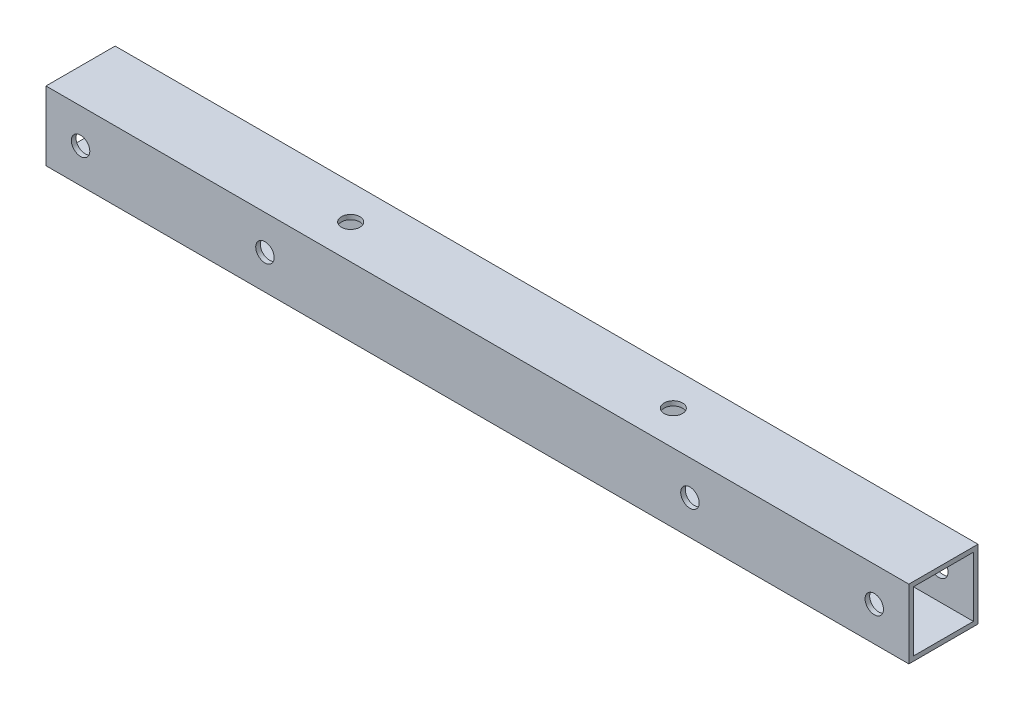
ISO-10303-21;
HEADER;
FILE_DESCRIPTION(('STEP AP214'),'2;1');
FILE_NAME('part.step','',(''),(''),'','','');
FILE_SCHEMA(('AUTOMOTIVE_DESIGN { 1 0 10303 214 1 1 1 1 }'));
ENDSEC;
DATA;
#1=APPLICATION_CONTEXT('core data for automotive mechanical design processes');
#2=APPLICATION_PROTOCOL_DEFINITION('international standard','automotive_design',2000,#1);
#3=PRODUCT_CONTEXT('',#1,'mechanical');
#4=PRODUCT('Part','Part','',(#3));
#5=PRODUCT_RELATED_PRODUCT_CATEGORY('part','',(#4));
#6=PRODUCT_DEFINITION_FORMATION('','',#4);
#7=PRODUCT_DEFINITION_CONTEXT('part definition',#1,'design');
#8=PRODUCT_DEFINITION('design','',#6,#7);
#9=PRODUCT_DEFINITION_SHAPE('','',#8);
#10=(LENGTH_UNIT() NAMED_UNIT(*) SI_UNIT(.MILLI.,.METRE.));
#11=(NAMED_UNIT(*) PLANE_ANGLE_UNIT() SI_UNIT($,.RADIAN.));
#12=(NAMED_UNIT(*) SI_UNIT($,.STERADIAN.) SOLID_ANGLE_UNIT());
#13=UNCERTAINTY_MEASURE_WITH_UNIT(LENGTH_MEASURE(1.E-05),#10,'distance_accuracy_value','');
#14=(GEOMETRIC_REPRESENTATION_CONTEXT(3) GLOBAL_UNCERTAINTY_ASSIGNED_CONTEXT((#13)) GLOBAL_UNIT_ASSIGNED_CONTEXT((#10,
#11,#12)) REPRESENTATION_CONTEXT('',''));
#15=CARTESIAN_POINT('',(0.,0.,0.));
#16=DIRECTION('',(0.,0.,1.));
#17=DIRECTION('',(1.,0.,0.));
#18=AXIS2_PLACEMENT_3D('',#15,#16,#17);
#19=CARTESIAN_POINT('',(187.2,0.,0.));
#20=DIRECTION('',(1.,0.,0.));
#21=DIRECTION('',(0.,0.,-1.));
#22=AXIS2_PLACEMENT_3D('',#19,#20,#21);
#23=PLANE('',#22);
#24=DIRECTION('',(0.,1.,0.));
#25=VECTOR('',#24,1.);
#26=CARTESIAN_POINT('',(187.2,-7.5,-7.5));
#27=LINE('',#26,#25);
#28=CARTESIAN_POINT('',(187.2,-7.5,-7.5));
#29=VERTEX_POINT('',#28);
#30=CARTESIAN_POINT('',(187.2,7.5,-7.5));
#31=VERTEX_POINT('',#30);
#32=EDGE_CURVE('E162',#29,#31,#27,.T.);
#33=ORIENTED_EDGE('',*,*,#32,.T.);
#34=DIRECTION('',(0.,0.,1.));
#35=VECTOR('',#34,1.);
#36=CARTESIAN_POINT('',(187.2,7.5,7.5));
#37=LINE('',#36,#35);
#38=CARTESIAN_POINT('',(187.2,7.5,7.5));
#39=VERTEX_POINT('',#38);
#40=EDGE_CURVE('E165',#31,#39,#37,.T.);
#41=ORIENTED_EDGE('',*,*,#40,.T.);
#42=DIRECTION('',(0.,-1.,0.));
#43=VECTOR('',#42,1.);
#44=CARTESIAN_POINT('',(187.2,-7.5,7.5));
#45=LINE('',#44,#43);
#46=CARTESIAN_POINT('',(187.2,-7.5,7.5));
#47=VERTEX_POINT('',#46);
#48=EDGE_CURVE('E168',#39,#47,#45,.T.);
#49=ORIENTED_EDGE('',*,*,#48,.T.);
#50=DIRECTION('',(0.,0.,-1.));
#51=VECTOR('',#50,1.);
#52=CARTESIAN_POINT('',(187.2,-7.5,7.5));
#53=LINE('',#52,#51);
#54=EDGE_CURVE('E170',#47,#29,#53,.T.);
#55=ORIENTED_EDGE('',*,*,#54,.T.);
#56=EDGE_LOOP('',(#33,#41,#49,#55));
#57=FACE_BOUND('',#56,.T.);
#58=DIRECTION('',(0.,0.,1.));
#59=VECTOR('',#58,1.);
#60=CARTESIAN_POINT('',(187.2,6.5,0.));
#61=LINE('',#60,#59);
#62=CARTESIAN_POINT('',(187.2,6.5,-6.5));
#63=VERTEX_POINT('',#62);
#64=CARTESIAN_POINT('',(187.2,6.5,6.5));
#65=VERTEX_POINT('',#64);
#66=EDGE_CURVE('E132',#63,#65,#61,.T.);
#67=ORIENTED_EDGE('',*,*,#66,.F.);
#68=DIRECTION('',(0.,1.,0.));
#69=VECTOR('',#68,1.);
#70=CARTESIAN_POINT('',(187.2,0.,-6.5));
#71=LINE('',#70,#69);
#72=CARTESIAN_POINT('',(187.2,-6.5,-6.5));
#73=VERTEX_POINT('',#72);
#74=EDGE_CURVE('E124',#73,#63,#71,.T.);
#75=ORIENTED_EDGE('',*,*,#74,.F.);
#76=DIRECTION('',(0.,0.,-1.));
#77=VECTOR('',#76,1.);
#78=CARTESIAN_POINT('',(187.2,-6.5,0.));
#79=LINE('',#78,#77);
#80=CARTESIAN_POINT('',(187.2,-6.5,6.5));
#81=VERTEX_POINT('',#80);
#82=EDGE_CURVE('E146',#81,#73,#79,.T.);
#83=ORIENTED_EDGE('',*,*,#82,.F.);
#84=DIRECTION('',(0.,-1.,0.));
#85=VECTOR('',#84,1.);
#86=CARTESIAN_POINT('',(187.2,0.,6.5));
#87=LINE('',#86,#85);
#88=EDGE_CURVE('E144',#65,#81,#87,.T.);
#89=ORIENTED_EDGE('',*,*,#88,.F.);
#90=EDGE_LOOP('',(#67,#75,#83,#89));
#91=FACE_BOUND('',#90,.T.);
#92=ADVANCED_FACE('F57',(#57,#91),#23,.T.);
#93=CARTESIAN_POINT('',(0.,0.,0.));
#94=DIRECTION('',(1.,0.,0.));
#95=DIRECTION('',(0.,0.,-1.));
#96=AXIS2_PLACEMENT_3D('',#93,#94,#95);
#97=PLANE('',#96);
#98=DIRECTION('',(0.,1.,0.));
#99=VECTOR('',#98,1.);
#100=CARTESIAN_POINT('',(0.,-7.5,-7.5));
#101=LINE('',#100,#99);
#102=CARTESIAN_POINT('',(0.,-7.5,-7.5));
#103=VERTEX_POINT('',#102);
#104=CARTESIAN_POINT('',(0.,7.5,-7.5));
#105=VERTEX_POINT('',#104);
#106=EDGE_CURVE('E140',#103,#105,#101,.T.);
#107=ORIENTED_EDGE('',*,*,#106,.F.);
#108=DIRECTION('',(0.,0.,-1.));
#109=VECTOR('',#108,1.);
#110=CARTESIAN_POINT('',(0.,-7.5,7.5));
#111=LINE('',#110,#109);
#112=CARTESIAN_POINT('',(0.,-7.5,7.5));
#113=VERTEX_POINT('',#112);
#114=EDGE_CURVE('E166',#113,#103,#111,.T.);
#115=ORIENTED_EDGE('',*,*,#114,.F.);
#116=DIRECTION('',(0.,-1.,0.));
#117=VECTOR('',#116,1.);
#118=CARTESIAN_POINT('',(0.,-7.5,7.5));
#119=LINE('',#118,#117);
#120=CARTESIAN_POINT('',(0.,7.5,7.5));
#121=VERTEX_POINT('',#120);
#122=EDGE_CURVE('E177',#121,#113,#119,.T.);
#123=ORIENTED_EDGE('',*,*,#122,.F.);
#124=DIRECTION('',(0.,0.,1.));
#125=VECTOR('',#124,1.);
#126=CARTESIAN_POINT('',(0.,7.5,7.5));
#127=LINE('',#126,#125);
#128=EDGE_CURVE('E175',#105,#121,#127,.T.);
#129=ORIENTED_EDGE('',*,*,#128,.F.);
#130=EDGE_LOOP('',(#107,#115,#123,#129));
#131=FACE_BOUND('',#130,.T.);
#132=DIRECTION('',(0.,1.,0.));
#133=VECTOR('',#132,1.);
#134=CARTESIAN_POINT('',(0.,0.,-6.5));
#135=LINE('',#134,#133);
#136=CARTESIAN_POINT('',(0.,-6.5,-6.5));
#137=VERTEX_POINT('',#136);
#138=CARTESIAN_POINT('',(0.,6.5,-6.5));
#139=VERTEX_POINT('',#138);
#140=EDGE_CURVE('E82',#137,#139,#135,.T.);
#141=ORIENTED_EDGE('',*,*,#140,.T.);
#142=DIRECTION('',(0.,0.,1.));
#143=VECTOR('',#142,1.);
#144=CARTESIAN_POINT('',(0.,6.5,0.));
#145=LINE('',#144,#143);
#146=CARTESIAN_POINT('',(0.,6.5,6.5));
#147=VERTEX_POINT('',#146);
#148=EDGE_CURVE('E139',#139,#147,#145,.T.);
#149=ORIENTED_EDGE('',*,*,#148,.T.);
#150=DIRECTION('',(0.,-1.,0.));
#151=VECTOR('',#150,1.);
#152=CARTESIAN_POINT('',(0.,0.,6.5));
#153=LINE('',#152,#151);
#154=CARTESIAN_POINT('',(0.,-6.5,6.5));
#155=VERTEX_POINT('',#154);
#156=EDGE_CURVE('E154',#147,#155,#153,.T.);
#157=ORIENTED_EDGE('',*,*,#156,.T.);
#158=DIRECTION('',(0.,0.,-1.));
#159=VECTOR('',#158,1.);
#160=CARTESIAN_POINT('',(0.,-6.5,0.));
#161=LINE('',#160,#159);
#162=EDGE_CURVE('E133',#155,#137,#161,.T.);
#163=ORIENTED_EDGE('',*,*,#162,.T.);
#164=EDGE_LOOP('',(#141,#149,#157,#163));
#165=FACE_BOUND('',#164,.T.);
#166=ADVANCED_FACE('F283',(#131,#165),#97,.F.);
#167=CARTESIAN_POINT('',(187.2,-7.5,-7.5));
#168=DIRECTION('',(0.,0.,1.));
#169=DIRECTION('',(1.,0.,0.));
#170=AXIS2_PLACEMENT_3D('',#167,#168,#169);
#171=PLANE('',#170);
#172=CARTESIAN_POINT('',(7.5,0.,-7.5));
#173=DIRECTION('',(0.,0.,1.));
#174=DIRECTION('',(1.,0.,0.));
#175=AXIS2_PLACEMENT_3D('',#172,#173,#174);
#176=CIRCLE('',#175,2.);
#177=CARTESIAN_POINT('',(9.5,0.,-7.5));
#178=VERTEX_POINT('',#177);
#179=EDGE_CURVE('E191',#178,#178,#176,.T.);
#180=ORIENTED_EDGE('',*,*,#179,.T.);
#181=EDGE_LOOP('',(#180));
#182=FACE_BOUND('',#181,.T.);
#183=CARTESIAN_POINT('',(47.5,0.,-7.5));
#184=DIRECTION('',(0.,0.,1.));
#185=DIRECTION('',(1.,0.,0.));
#186=AXIS2_PLACEMENT_3D('',#183,#184,#185);
#187=CIRCLE('',#186,2.);
#188=CARTESIAN_POINT('',(49.5,0.,-7.5));
#189=VERTEX_POINT('',#188);
#190=EDGE_CURVE('E233',#189,#189,#187,.T.);
#191=ORIENTED_EDGE('',*,*,#190,.T.);
#192=EDGE_LOOP('',(#191));
#193=FACE_BOUND('',#192,.T.);
#194=CARTESIAN_POINT('',(139.7,0.,-7.5));
#195=DIRECTION('',(0.,0.,1.));
#196=DIRECTION('',(-1.,0.,0.));
#197=AXIS2_PLACEMENT_3D('',#194,#195,#196);
#198=CIRCLE('',#197,2.);
#199=CARTESIAN_POINT('',(137.7,0.,-7.5));
#200=VERTEX_POINT('',#199);
#201=EDGE_CURVE('E239',#200,#200,#198,.T.);
#202=ORIENTED_EDGE('',*,*,#201,.T.);
#203=EDGE_LOOP('',(#202));
#204=FACE_BOUND('',#203,.T.);
#205=CARTESIAN_POINT('',(179.7,0.,-7.5));
#206=DIRECTION('',(0.,0.,1.));
#207=DIRECTION('',(-1.,0.,0.));
#208=AXIS2_PLACEMENT_3D('',#205,#206,#207);
#209=CIRCLE('',#208,2.);
#210=CARTESIAN_POINT('',(177.7,0.,-7.5));
#211=VERTEX_POINT('',#210);
#212=EDGE_CURVE('E245',#211,#211,#209,.T.);
#213=ORIENTED_EDGE('',*,*,#212,.T.);
#214=EDGE_LOOP('',(#213));
#215=FACE_BOUND('',#214,.T.);
#216=ORIENTED_EDGE('',*,*,#106,.T.);
#217=DIRECTION('',(-1.,0.,0.));
#218=VECTOR('',#217,1.);
#219=CARTESIAN_POINT('',(187.2,7.5,-7.5));
#220=LINE('',#219,#218);
#221=EDGE_CURVE('E12',#31,#105,#220,.T.);
#222=ORIENTED_EDGE('',*,*,#221,.F.);
#223=ORIENTED_EDGE('',*,*,#32,.F.);
#224=DIRECTION('',(-1.,0.,0.));
#225=VECTOR('',#224,1.);
#226=CARTESIAN_POINT('',(187.2,-7.5,-7.5));
#227=LINE('',#226,#225);
#228=EDGE_CURVE('E172',#29,#103,#227,.T.);
#229=ORIENTED_EDGE('',*,*,#228,.T.);
#230=EDGE_LOOP('',(#216,#222,#223,#229));
#231=FACE_BOUND('',#230,.T.);
#232=ADVANCED_FACE('F59',(#182,#193,#204,#215,#231),#171,.F.);
#233=CARTESIAN_POINT('',(187.2,7.5,7.5));
#234=DIRECTION('',(0.,-1.,0.));
#235=DIRECTION('',(0.,0.,-1.));
#236=AXIS2_PLACEMENT_3D('',#233,#234,#235);
#237=PLANE('',#236);
#238=CARTESIAN_POINT('',(58.6,7.5,0.));
#239=DIRECTION('',(0.,1.,0.));
#240=DIRECTION('',(0.,0.,1.));
#241=AXIS2_PLACEMENT_3D('',#238,#239,#240);
#242=CIRCLE('',#241,2.);
#243=CARTESIAN_POINT('',(58.6,7.5,2.));
#244=VERTEX_POINT('',#243);
#245=EDGE_CURVE('E211',#244,#244,#242,.T.);
#246=ORIENTED_EDGE('',*,*,#245,.F.);
#247=EDGE_LOOP('',(#246));
#248=FACE_BOUND('',#247,.T.);
#249=CARTESIAN_POINT('',(128.6,7.5,0.));
#250=DIRECTION('',(0.,1.,0.));
#251=DIRECTION('',(0.,0.,-1.));
#252=AXIS2_PLACEMENT_3D('',#249,#250,#251);
#253=CIRCLE('',#252,2.);
#254=CARTESIAN_POINT('',(128.6,7.5,-2.00000000000001));
#255=VERTEX_POINT('',#254);
#256=EDGE_CURVE('E221',#255,#255,#253,.T.);
#257=ORIENTED_EDGE('',*,*,#256,.F.);
#258=EDGE_LOOP('',(#257));
#259=FACE_BOUND('',#258,.T.);
#260=ORIENTED_EDGE('',*,*,#128,.T.);
#261=DIRECTION('',(-1.,0.,0.));
#262=VECTOR('',#261,1.);
#263=CARTESIAN_POINT('',(187.2,7.5,7.5));
#264=LINE('',#263,#262);
#265=EDGE_CURVE('E66',#39,#121,#264,.T.);
#266=ORIENTED_EDGE('',*,*,#265,.F.);
#267=ORIENTED_EDGE('',*,*,#40,.F.);
#268=ORIENTED_EDGE('',*,*,#221,.T.);
#269=EDGE_LOOP('',(#260,#266,#267,#268));
#270=FACE_BOUND('',#269,.T.);
#271=ADVANCED_FACE('F282',(#248,#259,#270),#237,.F.);
#272=CARTESIAN_POINT('',(187.2,-7.5,7.5));
#273=DIRECTION('',(0.,0.,-1.));
#274=DIRECTION('',(-1.,0.,0.));
#275=AXIS2_PLACEMENT_3D('',#272,#273,#274);
#276=PLANE('',#275);
#277=CARTESIAN_POINT('',(7.5,0.,7.5));
#278=DIRECTION('',(0.,0.,1.));
#279=DIRECTION('',(1.,0.,0.));
#280=AXIS2_PLACEMENT_3D('',#277,#278,#279);
#281=CIRCLE('',#280,2.);
#282=CARTESIAN_POINT('',(9.5,0.,7.5));
#283=VERTEX_POINT('',#282);
#284=EDGE_CURVE('E230',#283,#283,#281,.T.);
#285=ORIENTED_EDGE('',*,*,#284,.F.);
#286=EDGE_LOOP('',(#285));
#287=FACE_BOUND('',#286,.T.);
#288=CARTESIAN_POINT('',(47.5,0.,7.5));
#289=DIRECTION('',(0.,0.,1.));
#290=DIRECTION('',(1.,0.,0.));
#291=AXIS2_PLACEMENT_3D('',#288,#289,#290);
#292=CIRCLE('',#291,2.);
#293=CARTESIAN_POINT('',(49.5,0.,7.5));
#294=VERTEX_POINT('',#293);
#295=EDGE_CURVE('E236',#294,#294,#292,.T.);
#296=ORIENTED_EDGE('',*,*,#295,.F.);
#297=EDGE_LOOP('',(#296));
#298=FACE_BOUND('',#297,.T.);
#299=CARTESIAN_POINT('',(139.7,0.,7.5));
#300=DIRECTION('',(0.,0.,1.));
#301=DIRECTION('',(-1.,0.,0.));
#302=AXIS2_PLACEMENT_3D('',#299,#300,#301);
#303=CIRCLE('',#302,2.);
#304=CARTESIAN_POINT('',(137.7,0.,7.5));
#305=VERTEX_POINT('',#304);
#306=EDGE_CURVE('E242',#305,#305,#303,.T.);
#307=ORIENTED_EDGE('',*,*,#306,.F.);
#308=EDGE_LOOP('',(#307));
#309=FACE_BOUND('',#308,.T.);
#310=CARTESIAN_POINT('',(179.7,0.,7.5));
#311=DIRECTION('',(0.,0.,1.));
#312=DIRECTION('',(-1.,0.,0.));
#313=AXIS2_PLACEMENT_3D('',#310,#311,#312);
#314=CIRCLE('',#313,2.);
#315=CARTESIAN_POINT('',(177.7,0.,7.5));
#316=VERTEX_POINT('',#315);
#317=EDGE_CURVE('E227',#316,#316,#314,.T.);
#318=ORIENTED_EDGE('',*,*,#317,.F.);
#319=EDGE_LOOP('',(#318));
#320=FACE_BOUND('',#319,.T.);
#321=ORIENTED_EDGE('',*,*,#122,.T.);
#322=DIRECTION('',(-1.,0.,0.));
#323=VECTOR('',#322,1.);
#324=CARTESIAN_POINT('',(187.2,-7.5,7.5));
#325=LINE('',#324,#323);
#326=EDGE_CURVE('E182',#47,#113,#325,.T.);
#327=ORIENTED_EDGE('',*,*,#326,.F.);
#328=ORIENTED_EDGE('',*,*,#48,.F.);
#329=ORIENTED_EDGE('',*,*,#265,.T.);
#330=EDGE_LOOP('',(#321,#327,#328,#329));
#331=FACE_BOUND('',#330,.T.);
#332=ADVANCED_FACE('F301',(#287,#298,#309,#320,#331),#276,.F.);
#333=CARTESIAN_POINT('',(187.2,-7.5,7.5));
#334=DIRECTION('',(0.,1.,0.));
#335=DIRECTION('',(0.,0.,1.));
#336=AXIS2_PLACEMENT_3D('',#333,#334,#335);
#337=PLANE('',#336);
#338=CARTESIAN_POINT('',(58.6,-7.5,0.));
#339=DIRECTION('',(0.,1.,0.));
#340=DIRECTION('',(0.,0.,1.));
#341=AXIS2_PLACEMENT_3D('',#338,#339,#340);
#342=CIRCLE('',#341,2.);
#343=CARTESIAN_POINT('',(58.6,-7.5,2.));
#344=VERTEX_POINT('',#343);
#345=EDGE_CURVE('E205',#344,#344,#342,.T.);
#346=ORIENTED_EDGE('',*,*,#345,.T.);
#347=EDGE_LOOP('',(#346));
#348=FACE_BOUND('',#347,.T.);
#349=CARTESIAN_POINT('',(128.6,-7.5,0.));
#350=DIRECTION('',(0.,1.,0.));
#351=DIRECTION('',(0.,0.,-1.));
#352=AXIS2_PLACEMENT_3D('',#349,#350,#351);
#353=CIRCLE('',#352,2.);
#354=CARTESIAN_POINT('',(128.6,-7.5,-2.00000000000001));
#355=VERTEX_POINT('',#354);
#356=EDGE_CURVE('E216',#355,#355,#353,.T.);
#357=ORIENTED_EDGE('',*,*,#356,.T.);
#358=EDGE_LOOP('',(#357));
#359=FACE_BOUND('',#358,.T.);
#360=ORIENTED_EDGE('',*,*,#114,.T.);
#361=ORIENTED_EDGE('',*,*,#228,.F.);
#362=ORIENTED_EDGE('',*,*,#54,.F.);
#363=ORIENTED_EDGE('',*,*,#326,.T.);
#364=EDGE_LOOP('',(#360,#361,#362,#363));
#365=FACE_BOUND('',#364,.T.);
#366=ADVANCED_FACE('F263',(#348,#359,#365),#337,.F.);
#367=CARTESIAN_POINT('',(187.2,0.,-6.5));
#368=DIRECTION('',(0.,0.,1.));
#369=DIRECTION('',(1.,0.,0.));
#370=AXIS2_PLACEMENT_3D('',#367,#368,#369);
#371=PLANE('',#370);
#372=CARTESIAN_POINT('',(7.5,0.,-6.5));
#373=DIRECTION('',(0.,0.,1.));
#374=DIRECTION('',(1.,0.,0.));
#375=AXIS2_PLACEMENT_3D('',#372,#373,#374);
#376=CIRCLE('',#375,2.);
#377=CARTESIAN_POINT('',(9.5,0.,-6.5));
#378=VERTEX_POINT('',#377);
#379=EDGE_CURVE('E152',#378,#378,#376,.T.);
#380=ORIENTED_EDGE('',*,*,#379,.F.);
#381=EDGE_LOOP('',(#380));
#382=FACE_BOUND('',#381,.T.);
#383=CARTESIAN_POINT('',(47.5,0.,-6.5));
#384=DIRECTION('',(0.,0.,1.));
#385=DIRECTION('',(1.,0.,0.));
#386=AXIS2_PLACEMENT_3D('',#383,#384,#385);
#387=CIRCLE('',#386,2.);
#388=CARTESIAN_POINT('',(49.5,0.,-6.5));
#389=VERTEX_POINT('',#388);
#390=EDGE_CURVE('E199',#389,#389,#387,.T.);
#391=ORIENTED_EDGE('',*,*,#390,.F.);
#392=EDGE_LOOP('',(#391));
#393=FACE_BOUND('',#392,.T.);
#394=CARTESIAN_POINT('',(139.7,0.,-6.5));
#395=DIRECTION('',(0.,0.,1.));
#396=DIRECTION('',(1.,0.,0.));
#397=AXIS2_PLACEMENT_3D('',#394,#395,#396);
#398=CIRCLE('',#397,2.);
#399=CARTESIAN_POINT('',(141.7,0.,-6.5));
#400=VERTEX_POINT('',#399);
#401=EDGE_CURVE('E195',#400,#400,#398,.T.);
#402=ORIENTED_EDGE('',*,*,#401,.F.);
#403=EDGE_LOOP('',(#402));
#404=FACE_BOUND('',#403,.T.);
#405=CARTESIAN_POINT('',(179.7,0.,-6.5));
#406=DIRECTION('',(0.,0.,1.));
#407=DIRECTION('',(1.,0.,0.));
#408=AXIS2_PLACEMENT_3D('',#405,#406,#407);
#409=CIRCLE('',#408,2.);
#410=CARTESIAN_POINT('',(181.7,0.,-6.5));
#411=VERTEX_POINT('',#410);
#412=EDGE_CURVE('E190',#411,#411,#409,.T.);
#413=ORIENTED_EDGE('',*,*,#412,.F.);
#414=EDGE_LOOP('',(#413));
#415=FACE_BOUND('',#414,.T.);
#416=ORIENTED_EDGE('',*,*,#140,.F.);
#417=DIRECTION('',(-1.,0.,0.));
#418=VECTOR('',#417,1.);
#419=CARTESIAN_POINT('',(187.2,-6.5,-6.5));
#420=LINE('',#419,#418);
#421=EDGE_CURVE('E128',#73,#137,#420,.T.);
#422=ORIENTED_EDGE('',*,*,#421,.F.);
#423=ORIENTED_EDGE('',*,*,#74,.T.);
#424=DIRECTION('',(-1.,0.,0.));
#425=VECTOR('',#424,1.);
#426=CARTESIAN_POINT('',(187.2,6.5,-6.5));
#427=LINE('',#426,#425);
#428=EDGE_CURVE('E127',#63,#139,#427,.T.);
#429=ORIENTED_EDGE('',*,*,#428,.T.);
#430=EDGE_LOOP('',(#416,#422,#423,#429));
#431=FACE_BOUND('',#430,.T.);
#432=ADVANCED_FACE('F126',(#382,#393,#404,#415,#431),#371,.T.);
#433=CARTESIAN_POINT('',(187.2,6.5,0.));
#434=DIRECTION('',(0.,-1.,0.));
#435=DIRECTION('',(0.,0.,-1.));
#436=AXIS2_PLACEMENT_3D('',#433,#434,#435);
#437=PLANE('',#436);
#438=CARTESIAN_POINT('',(58.6,6.5,0.));
#439=DIRECTION('',(0.,-1.,0.));
#440=DIRECTION('',(0.,0.,-1.));
#441=AXIS2_PLACEMENT_3D('',#438,#439,#440);
#442=CIRCLE('',#441,2.);
#443=CARTESIAN_POINT('',(58.6,6.5,-2.));
#444=VERTEX_POINT('',#443);
#445=EDGE_CURVE('E224',#444,#444,#442,.T.);
#446=ORIENTED_EDGE('',*,*,#445,.F.);
#447=EDGE_LOOP('',(#446));
#448=FACE_BOUND('',#447,.T.);
#449=CARTESIAN_POINT('',(128.6,6.5,0.));
#450=DIRECTION('',(0.,-1.,0.));
#451=DIRECTION('',(0.,0.,-1.));
#452=AXIS2_PLACEMENT_3D('',#449,#450,#451);
#453=CIRCLE('',#452,2.);
#454=CARTESIAN_POINT('',(128.6,6.5,-2.00000000000001));
#455=VERTEX_POINT('',#454);
#456=EDGE_CURVE('E204',#455,#455,#453,.T.);
#457=ORIENTED_EDGE('',*,*,#456,.F.);
#458=EDGE_LOOP('',(#457));
#459=FACE_BOUND('',#458,.T.);
#460=ORIENTED_EDGE('',*,*,#148,.F.);
#461=ORIENTED_EDGE('',*,*,#428,.F.);
#462=ORIENTED_EDGE('',*,*,#66,.T.);
#463=DIRECTION('',(-1.,0.,0.));
#464=VECTOR('',#463,1.);
#465=CARTESIAN_POINT('',(187.2,6.5,6.5));
#466=LINE('',#465,#464);
#467=EDGE_CURVE('E141',#65,#147,#466,.T.);
#468=ORIENTED_EDGE('',*,*,#467,.T.);
#469=EDGE_LOOP('',(#460,#461,#462,#468));
#470=FACE_BOUND('',#469,.T.);
#471=ADVANCED_FACE('F136',(#448,#459,#470),#437,.T.);
#472=CARTESIAN_POINT('',(187.2,0.,6.5));
#473=DIRECTION('',(0.,0.,-1.));
#474=DIRECTION('',(-1.,0.,0.));
#475=AXIS2_PLACEMENT_3D('',#472,#473,#474);
#476=PLANE('',#475);
#477=CARTESIAN_POINT('',(7.5,0.,6.5));
#478=DIRECTION('',(0.,0.,-1.));
#479=DIRECTION('',(-1.,0.,0.));
#480=AXIS2_PLACEMENT_3D('',#477,#478,#479);
#481=CIRCLE('',#480,2.);
#482=CARTESIAN_POINT('',(5.5,0.,6.5));
#483=VERTEX_POINT('',#482);
#484=EDGE_CURVE('E200',#483,#483,#481,.T.);
#485=ORIENTED_EDGE('',*,*,#484,.F.);
#486=EDGE_LOOP('',(#485));
#487=FACE_BOUND('',#486,.T.);
#488=CARTESIAN_POINT('',(47.5,0.,6.5));
#489=DIRECTION('',(0.,0.,-1.));
#490=DIRECTION('',(-1.,0.,0.));
#491=AXIS2_PLACEMENT_3D('',#488,#489,#490);
#492=CIRCLE('',#491,2.);
#493=CARTESIAN_POINT('',(45.5,0.,6.5));
#494=VERTEX_POINT('',#493);
#495=EDGE_CURVE('E196',#494,#494,#492,.T.);
#496=ORIENTED_EDGE('',*,*,#495,.F.);
#497=EDGE_LOOP('',(#496));
#498=FACE_BOUND('',#497,.T.);
#499=CARTESIAN_POINT('',(139.7,0.,6.5));
#500=DIRECTION('',(0.,0.,-1.));
#501=DIRECTION('',(-1.,0.,0.));
#502=AXIS2_PLACEMENT_3D('',#499,#500,#501);
#503=CIRCLE('',#502,2.);
#504=CARTESIAN_POINT('',(137.7,0.,6.5));
#505=VERTEX_POINT('',#504);
#506=EDGE_CURVE('E192',#505,#505,#503,.T.);
#507=ORIENTED_EDGE('',*,*,#506,.F.);
#508=EDGE_LOOP('',(#507));
#509=FACE_BOUND('',#508,.T.);
#510=CARTESIAN_POINT('',(179.7,0.,6.5));
#511=DIRECTION('',(0.,0.,-1.));
#512=DIRECTION('',(-1.,0.,0.));
#513=AXIS2_PLACEMENT_3D('',#510,#511,#512);
#514=CIRCLE('',#513,2.);
#515=CARTESIAN_POINT('',(177.7,0.,6.5));
#516=VERTEX_POINT('',#515);
#517=EDGE_CURVE('E187',#516,#516,#514,.T.);
#518=ORIENTED_EDGE('',*,*,#517,.F.);
#519=EDGE_LOOP('',(#518));
#520=FACE_BOUND('',#519,.T.);
#521=ORIENTED_EDGE('',*,*,#156,.F.);
#522=ORIENTED_EDGE('',*,*,#467,.F.);
#523=ORIENTED_EDGE('',*,*,#88,.T.);
#524=DIRECTION('',(-1.,0.,0.));
#525=VECTOR('',#524,1.);
#526=CARTESIAN_POINT('',(187.2,-6.5,6.5));
#527=LINE('',#526,#525);
#528=EDGE_CURVE('E74',#81,#155,#527,.T.);
#529=ORIENTED_EDGE('',*,*,#528,.T.);
#530=EDGE_LOOP('',(#521,#522,#523,#529));
#531=FACE_BOUND('',#530,.T.);
#532=ADVANCED_FACE('F322',(#487,#498,#509,#520,#531),#476,.T.);
#533=CARTESIAN_POINT('',(187.2,-6.5,0.));
#534=DIRECTION('',(0.,1.,0.));
#535=DIRECTION('',(0.,0.,1.));
#536=AXIS2_PLACEMENT_3D('',#533,#534,#535);
#537=PLANE('',#536);
#538=CARTESIAN_POINT('',(58.6,-6.5,0.));
#539=DIRECTION('',(0.,1.,0.));
#540=DIRECTION('',(0.,0.,1.));
#541=AXIS2_PLACEMENT_3D('',#538,#539,#540);
#542=CIRCLE('',#541,2.);
#543=CARTESIAN_POINT('',(58.6,-6.5,2.));
#544=VERTEX_POINT('',#543);
#545=EDGE_CURVE('E61',#544,#544,#542,.T.);
#546=ORIENTED_EDGE('',*,*,#545,.F.);
#547=EDGE_LOOP('',(#546));
#548=FACE_BOUND('',#547,.T.);
#549=CARTESIAN_POINT('',(128.6,-6.5,0.));
#550=DIRECTION('',(0.,1.,0.));
#551=DIRECTION('',(0.,0.,1.));
#552=AXIS2_PLACEMENT_3D('',#549,#550,#551);
#553=CIRCLE('',#552,2.);
#554=CARTESIAN_POINT('',(128.6,-6.5,1.99999999999999));
#555=VERTEX_POINT('',#554);
#556=EDGE_CURVE('E202',#555,#555,#553,.T.);
#557=ORIENTED_EDGE('',*,*,#556,.F.);
#558=EDGE_LOOP('',(#557));
#559=FACE_BOUND('',#558,.T.);
#560=ORIENTED_EDGE('',*,*,#162,.F.);
#561=ORIENTED_EDGE('',*,*,#528,.F.);
#562=ORIENTED_EDGE('',*,*,#82,.T.);
#563=ORIENTED_EDGE('',*,*,#421,.T.);
#564=EDGE_LOOP('',(#560,#561,#562,#563));
#565=FACE_BOUND('',#564,.T.);
#566=ADVANCED_FACE('F326',(#548,#559,#565),#537,.T.);
#567=CARTESIAN_POINT('',(179.7,0.,-7.5));
#568=DIRECTION('',(0.,0.,1.));
#569=DIRECTION('',(1.,0.,0.));
#570=AXIS2_PLACEMENT_3D('',#567,#568,#569);
#571=CYLINDRICAL_SURFACE('',#570,2.);
#572=ORIENTED_EDGE('',*,*,#517,.T.);
#573=EDGE_LOOP('',(#572));
#574=FACE_BOUND('',#573,.T.);
#575=ORIENTED_EDGE('',*,*,#317,.T.);
#576=EDGE_LOOP('',(#575));
#577=FACE_BOUND('',#576,.T.);
#578=ADVANCED_FACE('F277',(#574,#577),#571,.F.);
#579=CARTESIAN_POINT('',(139.7,0.,-7.5));
#580=DIRECTION('',(0.,0.,1.));
#581=DIRECTION('',(1.,0.,0.));
#582=AXIS2_PLACEMENT_3D('',#579,#580,#581);
#583=CYLINDRICAL_SURFACE('',#582,2.);
#584=ORIENTED_EDGE('',*,*,#506,.T.);
#585=EDGE_LOOP('',(#584));
#586=FACE_BOUND('',#585,.T.);
#587=ORIENTED_EDGE('',*,*,#306,.T.);
#588=EDGE_LOOP('',(#587));
#589=FACE_BOUND('',#588,.T.);
#590=ADVANCED_FACE('F332',(#586,#589),#583,.F.);
#591=CARTESIAN_POINT('',(47.5,0.,-7.5));
#592=DIRECTION('',(0.,0.,1.));
#593=DIRECTION('',(1.,0.,0.));
#594=AXIS2_PLACEMENT_3D('',#591,#592,#593);
#595=CYLINDRICAL_SURFACE('',#594,2.);
#596=ORIENTED_EDGE('',*,*,#495,.T.);
#597=EDGE_LOOP('',(#596));
#598=FACE_BOUND('',#597,.T.);
#599=ORIENTED_EDGE('',*,*,#295,.T.);
#600=EDGE_LOOP('',(#599));
#601=FACE_BOUND('',#600,.T.);
#602=ADVANCED_FACE('F336',(#598,#601),#595,.F.);
#603=CARTESIAN_POINT('',(7.5,0.,-7.5));
#604=DIRECTION('',(0.,0.,1.));
#605=DIRECTION('',(1.,0.,0.));
#606=AXIS2_PLACEMENT_3D('',#603,#604,#605);
#607=CYLINDRICAL_SURFACE('',#606,2.);
#608=ORIENTED_EDGE('',*,*,#484,.T.);
#609=EDGE_LOOP('',(#608));
#610=FACE_BOUND('',#609,.T.);
#611=ORIENTED_EDGE('',*,*,#284,.T.);
#612=EDGE_LOOP('',(#611));
#613=FACE_BOUND('',#612,.T.);
#614=ADVANCED_FACE('F275',(#610,#613),#607,.F.);
#615=ORIENTED_EDGE('',*,*,#412,.T.);
#616=EDGE_LOOP('',(#615));
#617=FACE_BOUND('',#616,.T.);
#618=ORIENTED_EDGE('',*,*,#212,.F.);
#619=EDGE_LOOP('',(#618));
#620=FACE_BOUND('',#619,.T.);
#621=ADVANCED_FACE('F271',(#617,#620),#571,.F.);
#622=ORIENTED_EDGE('',*,*,#401,.T.);
#623=EDGE_LOOP('',(#622));
#624=FACE_BOUND('',#623,.T.);
#625=ORIENTED_EDGE('',*,*,#201,.F.);
#626=EDGE_LOOP('',(#625));
#627=FACE_BOUND('',#626,.T.);
#628=ADVANCED_FACE('F274',(#624,#627),#583,.F.);
#629=ORIENTED_EDGE('',*,*,#390,.T.);
#630=EDGE_LOOP('',(#629));
#631=FACE_BOUND('',#630,.T.);
#632=ORIENTED_EDGE('',*,*,#190,.F.);
#633=EDGE_LOOP('',(#632));
#634=FACE_BOUND('',#633,.T.);
#635=ADVANCED_FACE('F341',(#631,#634),#595,.F.);
#636=ORIENTED_EDGE('',*,*,#379,.T.);
#637=EDGE_LOOP('',(#636));
#638=FACE_BOUND('',#637,.T.);
#639=ORIENTED_EDGE('',*,*,#179,.F.);
#640=EDGE_LOOP('',(#639));
#641=FACE_BOUND('',#640,.T.);
#642=ADVANCED_FACE('F258',(#638,#641),#607,.F.);
#643=CARTESIAN_POINT('',(128.6,-7.5,0.));
#644=DIRECTION('',(0.,1.,0.));
#645=DIRECTION('',(0.,0.,1.));
#646=AXIS2_PLACEMENT_3D('',#643,#644,#645);
#647=CYLINDRICAL_SURFACE('',#646,2.);
#648=ORIENTED_EDGE('',*,*,#556,.T.);
#649=EDGE_LOOP('',(#648));
#650=FACE_BOUND('',#649,.T.);
#651=ORIENTED_EDGE('',*,*,#356,.F.);
#652=EDGE_LOOP('',(#651));
#653=FACE_BOUND('',#652,.T.);
#654=ADVANCED_FACE('F345',(#650,#653),#647,.F.);
#655=CARTESIAN_POINT('',(58.6,-7.5,0.));
#656=DIRECTION('',(0.,1.,0.));
#657=DIRECTION('',(0.,0.,1.));
#658=AXIS2_PLACEMENT_3D('',#655,#656,#657);
#659=CYLINDRICAL_SURFACE('',#658,2.);
#660=ORIENTED_EDGE('',*,*,#545,.T.);
#661=EDGE_LOOP('',(#660));
#662=FACE_BOUND('',#661,.T.);
#663=ORIENTED_EDGE('',*,*,#345,.F.);
#664=EDGE_LOOP('',(#663));
#665=FACE_BOUND('',#664,.T.);
#666=ADVANCED_FACE('F348',(#662,#665),#659,.F.);
#667=ORIENTED_EDGE('',*,*,#456,.T.);
#668=EDGE_LOOP('',(#667));
#669=FACE_BOUND('',#668,.T.);
#670=ORIENTED_EDGE('',*,*,#256,.T.);
#671=EDGE_LOOP('',(#670));
#672=FACE_BOUND('',#671,.T.);
#673=ADVANCED_FACE('F349',(#669,#672),#647,.F.);
#674=ORIENTED_EDGE('',*,*,#445,.T.);
#675=EDGE_LOOP('',(#674));
#676=FACE_BOUND('',#675,.T.);
#677=ORIENTED_EDGE('',*,*,#245,.T.);
#678=EDGE_LOOP('',(#677));
#679=FACE_BOUND('',#678,.T.);
#680=ADVANCED_FACE('F352',(#676,#679),#659,.F.);
#681=CLOSED_SHELL('',(#92,#166,#232,#271,#332,#366,#432,#471,#532,#566,#578,#590,#602,#614,#621,
#628,#635,#642,#654,#666,#673,#680));
#682=MANIFOLD_SOLID_BREP('B2',#681);
#683=ADVANCED_BREP_SHAPE_REPRESENTATION('',(#18,#682),#14);
#684=SHAPE_DEFINITION_REPRESENTATION(#9,#683);
ENDSEC;
END-ISO-10303-21;
